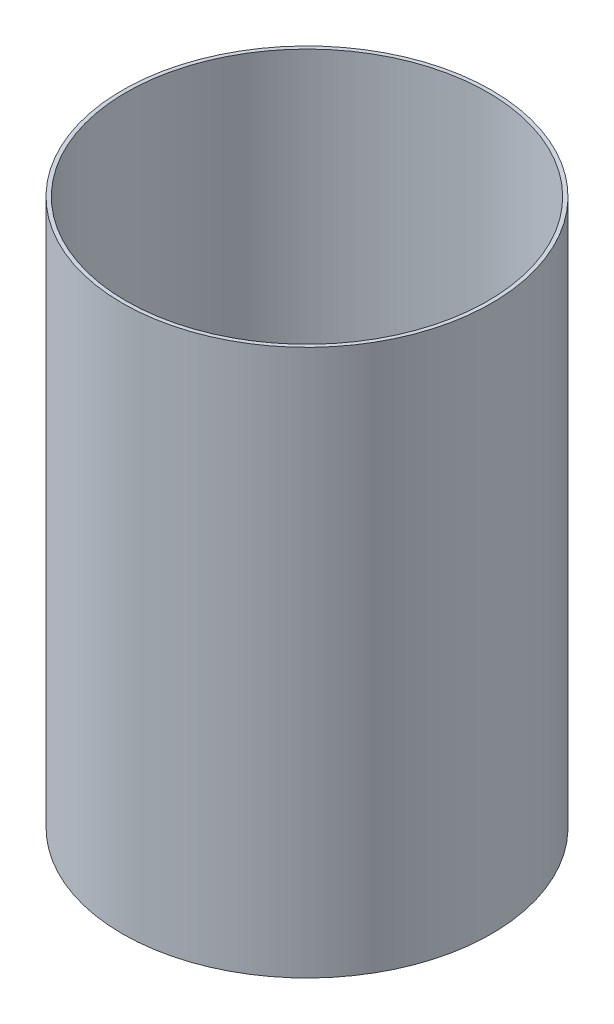
ISO-10303-21;
HEADER;
FILE_DESCRIPTION(('STEP AP214'),'2;1');
FILE_NAME('part.step','',(''),(''),'','','');
FILE_SCHEMA(('AUTOMOTIVE_DESIGN { 1 0 10303 214 1 1 1 1 }'));
ENDSEC;
DATA;
#1=APPLICATION_CONTEXT('core data for automotive mechanical design processes');
#2=APPLICATION_PROTOCOL_DEFINITION('international standard','automotive_design',2000,#1);
#3=PRODUCT_CONTEXT('',#1,'mechanical');
#4=PRODUCT('Part','Part','',(#3));
#5=PRODUCT_RELATED_PRODUCT_CATEGORY('part','',(#4));
#6=PRODUCT_DEFINITION_FORMATION('','',#4);
#7=PRODUCT_DEFINITION_CONTEXT('part definition',#1,'design');
#8=PRODUCT_DEFINITION('design','',#6,#7);
#9=PRODUCT_DEFINITION_SHAPE('','',#8);
#10=(LENGTH_UNIT() NAMED_UNIT(*) SI_UNIT(.MILLI.,.METRE.));
#11=(NAMED_UNIT(*) PLANE_ANGLE_UNIT() SI_UNIT($,.RADIAN.));
#12=(NAMED_UNIT(*) SI_UNIT($,.STERADIAN.) SOLID_ANGLE_UNIT());
#13=UNCERTAINTY_MEASURE_WITH_UNIT(LENGTH_MEASURE(1.E-05),#10,'distance_accuracy_value','');
#14=(GEOMETRIC_REPRESENTATION_CONTEXT(3) GLOBAL_UNCERTAINTY_ASSIGNED_CONTEXT((#13)) GLOBAL_UNIT_ASSIGNED_CONTEXT((#10,
#11,#12)) REPRESENTATION_CONTEXT('',''));
#15=CARTESIAN_POINT('',(0.,0.,0.));
#16=DIRECTION('',(0.,0.,1.));
#17=DIRECTION('',(1.,0.,0.));
#18=AXIS2_PLACEMENT_3D('',#15,#16,#17);
#19=CARTESIAN_POINT('',(0.,736.6,0.));
#20=DIRECTION('',(0.,-1.,0.));
#21=DIRECTION('',(0.,0.,-1.));
#22=AXIS2_PLACEMENT_3D('',#19,#20,#21);
#23=CYLINDRICAL_SURFACE('',#22,248.919999999986);
#24=CARTESIAN_POINT('',(0.,736.6,0.));
#25=DIRECTION('',(0.,1.,0.));
#26=DIRECTION('',(0.,0.,1.));
#27=AXIS2_PLACEMENT_3D('',#24,#25,#26);
#28=CIRCLE('',#27,248.919999999986);
#29=CARTESIAN_POINT('',(0.,736.6,248.919999999986));
#30=VERTEX_POINT('',#29);
#31=EDGE_CURVE('E10',#30,#30,#28,.T.);
#32=ORIENTED_EDGE('',*,*,#31,.F.);
#33=EDGE_LOOP('',(#32));
#34=FACE_BOUND('',#33,.T.);
#35=CARTESIAN_POINT('',(0.,0.,0.));
#36=DIRECTION('',(0.,1.,0.));
#37=DIRECTION('',(0.,0.,1.));
#38=AXIS2_PLACEMENT_3D('',#35,#36,#37);
#39=CIRCLE('',#38,248.919999999986);
#40=CARTESIAN_POINT('',(0.,0.,248.919999999986));
#41=VERTEX_POINT('',#40);
#42=EDGE_CURVE('E38',#41,#41,#39,.T.);
#43=ORIENTED_EDGE('',*,*,#42,.T.);
#44=EDGE_LOOP('',(#43));
#45=FACE_BOUND('',#44,.T.);
#46=ADVANCED_FACE('F35',(#34,#45),#23,.T.);
#47=CARTESIAN_POINT('',(0.,736.6,0.));
#48=DIRECTION('',(0.,1.,0.));
#49=DIRECTION('',(0.,0.,1.));
#50=AXIS2_PLACEMENT_3D('',#47,#48,#49);
#51=PLANE('',#50);
#52=CARTESIAN_POINT('',(0.,736.6,0.));
#53=DIRECTION('',(0.,1.,0.));
#54=DIRECTION('',(0.,0.,1.));
#55=AXIS2_PLACEMENT_3D('',#52,#53,#54);
#56=CIRCLE('',#55,243.84);
#57=CARTESIAN_POINT('',(0.,736.6,243.84));
#58=VERTEX_POINT('',#57);
#59=EDGE_CURVE('E47',#58,#58,#56,.T.);
#60=ORIENTED_EDGE('',*,*,#59,.F.);
#61=EDGE_LOOP('',(#60));
#62=FACE_BOUND('',#61,.T.);
#63=ORIENTED_EDGE('',*,*,#31,.T.);
#64=EDGE_LOOP('',(#63));
#65=FACE_BOUND('',#64,.T.);
#66=ADVANCED_FACE('F62',(#62,#65),#51,.T.);
#67=CARTESIAN_POINT('',(0.,0.,0.));
#68=DIRECTION('',(0.,1.,0.));
#69=DIRECTION('',(0.,0.,1.));
#70=AXIS2_PLACEMENT_3D('',#67,#68,#69);
#71=PLANE('',#70);
#72=ORIENTED_EDGE('',*,*,#42,.F.);
#73=EDGE_LOOP('',(#72));
#74=FACE_BOUND('',#73,.T.);
#75=ADVANCED_FACE('F58',(#74),#71,.F.);
#76=CARTESIAN_POINT('',(0.,25.4000000000001,0.));
#77=DIRECTION('',(0.,1.,0.));
#78=DIRECTION('',(0.,0.,1.));
#79=AXIS2_PLACEMENT_3D('',#76,#77,#78);
#80=CYLINDRICAL_SURFACE('',#79,243.84);
#81=CARTESIAN_POINT('',(0.,25.4000000000001,0.));
#82=DIRECTION('',(0.,1.,0.));
#83=DIRECTION('',(0.,0.,1.));
#84=AXIS2_PLACEMENT_3D('',#81,#82,#83);
#85=CIRCLE('',#84,243.84);
#86=CARTESIAN_POINT('',(0.,25.4000000000001,243.84));
#87=VERTEX_POINT('',#86);
#88=EDGE_CURVE('E45',#87,#87,#85,.T.);
#89=ORIENTED_EDGE('',*,*,#88,.F.);
#90=EDGE_LOOP('',(#89));
#91=FACE_BOUND('',#90,.T.);
#92=ORIENTED_EDGE('',*,*,#59,.T.);
#93=EDGE_LOOP('',(#92));
#94=FACE_BOUND('',#93,.T.);
#95=ADVANCED_FACE('F55',(#91,#94),#80,.F.);
#96=CARTESIAN_POINT('',(0.,25.4000000000001,0.));
#97=DIRECTION('',(0.,1.,0.));
#98=DIRECTION('',(0.,0.,1.));
#99=AXIS2_PLACEMENT_3D('',#96,#97,#98);
#100=PLANE('',#99);
#101=ORIENTED_EDGE('',*,*,#88,.T.);
#102=EDGE_LOOP('',(#101));
#103=FACE_BOUND('',#102,.T.);
#104=ADVANCED_FACE('F53',(#103),#100,.T.);
#105=CLOSED_SHELL('',(#46,#66,#75,#95,#104));
#106=MANIFOLD_SOLID_BREP('B2',#105);
#107=ADVANCED_BREP_SHAPE_REPRESENTATION('',(#18,#106),#14);
#108=SHAPE_DEFINITION_REPRESENTATION(#9,#107);
ENDSEC;
END-ISO-10303-21;
